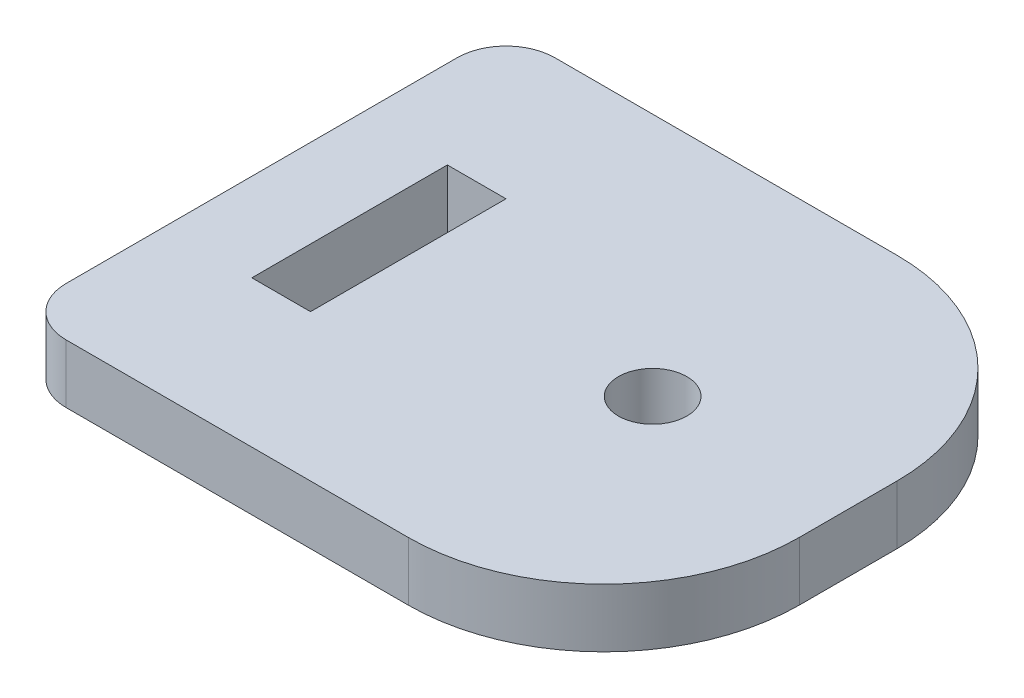
ISO-10303-21;
HEADER;
FILE_DESCRIPTION(('STEP AP214'),'2;1');
FILE_NAME('part.step','',(''),(''),'','','');
FILE_SCHEMA(('AUTOMOTIVE_DESIGN { 1 0 10303 214 1 1 1 1 }'));
ENDSEC;
DATA;
#1=APPLICATION_CONTEXT('core data for automotive mechanical design processes');
#2=APPLICATION_PROTOCOL_DEFINITION('international standard','automotive_design',2000,#1);
#3=PRODUCT_CONTEXT('',#1,'mechanical');
#4=PRODUCT('Part','Part','',(#3));
#5=PRODUCT_RELATED_PRODUCT_CATEGORY('part','',(#4));
#6=PRODUCT_DEFINITION_FORMATION('','',#4);
#7=PRODUCT_DEFINITION_CONTEXT('part definition',#1,'design');
#8=PRODUCT_DEFINITION('design','',#6,#7);
#9=PRODUCT_DEFINITION_SHAPE('','',#8);
#10=(LENGTH_UNIT() NAMED_UNIT(*) SI_UNIT(.MILLI.,.METRE.));
#11=(NAMED_UNIT(*) PLANE_ANGLE_UNIT() SI_UNIT($,.RADIAN.));
#12=(NAMED_UNIT(*) SI_UNIT($,.STERADIAN.) SOLID_ANGLE_UNIT());
#13=UNCERTAINTY_MEASURE_WITH_UNIT(LENGTH_MEASURE(1.E-05),#10,'distance_accuracy_value','');
#14=(GEOMETRIC_REPRESENTATION_CONTEXT(3) GLOBAL_UNCERTAINTY_ASSIGNED_CONTEXT((#13)) GLOBAL_UNIT_ASSIGNED_CONTEXT((#10,
#11,#12)) REPRESENTATION_CONTEXT('',''));
#15=CARTESIAN_POINT('',(0.,0.,0.));
#16=DIRECTION('',(0.,0.,1.));
#17=DIRECTION('',(1.,0.,0.));
#18=AXIS2_PLACEMENT_3D('',#15,#16,#17);
#19=CARTESIAN_POINT('',(-12.5,3.,10.));
#20=DIRECTION('',(0.,-1.,0.));
#21=DIRECTION('',(0.,0.,-1.));
#22=AXIS2_PLACEMENT_3D('',#19,#20,#21);
#23=PLANE('',#22);
#24=CARTESIAN_POINT('',(-12.5,3.,10.));
#25=DIRECTION('',(0.,1.,0.));
#26=DIRECTION('',(0.,0.,-1.));
#27=AXIS2_PLACEMENT_3D('',#24,#25,#26);
#28=CIRCLE('',#27,2.5);
#29=CARTESIAN_POINT('',(-15.,3.,9.99999999999998));
#30=VERTEX_POINT('',#29);
#31=CARTESIAN_POINT('',(-12.5,3.,12.5));
#32=VERTEX_POINT('',#31);
#33=EDGE_CURVE('E161',#30,#32,#28,.T.);
#34=ORIENTED_EDGE('',*,*,#33,.T.);
#35=DIRECTION('',(1.,0.,0.));
#36=VECTOR('',#35,1.);
#37=CARTESIAN_POINT('',(-12.5,3.,12.5));
#38=LINE('',#37,#36);
#39=CARTESIAN_POINT('',(4.99999999999993,3.,12.5));
#40=VERTEX_POINT('',#39);
#41=EDGE_CURVE('E164',#32,#40,#38,.T.);
#42=ORIENTED_EDGE('',*,*,#41,.T.);
#43=CARTESIAN_POINT('',(5.,3.,2.5));
#44=DIRECTION('',(0.,1.,0.));
#45=DIRECTION('',(0.,0.,-1.));
#46=AXIS2_PLACEMENT_3D('',#43,#44,#45);
#47=CIRCLE('',#46,10.);
#48=CARTESIAN_POINT('',(15.,3.,2.49999999999993));
#49=VERTEX_POINT('',#48);
#50=EDGE_CURVE('E167',#40,#49,#47,.T.);
#51=ORIENTED_EDGE('',*,*,#50,.T.);
#52=DIRECTION('',(0.,0.,-1.));
#53=VECTOR('',#52,1.);
#54=CARTESIAN_POINT('',(15.,3.,2.49999999999993));
#55=LINE('',#54,#53);
#56=CARTESIAN_POINT('',(15.,3.,-2.49999999999993));
#57=VERTEX_POINT('',#56);
#58=EDGE_CURVE('E169',#49,#57,#55,.T.);
#59=ORIENTED_EDGE('',*,*,#58,.T.);
#60=CARTESIAN_POINT('',(5.,3.,-2.5));
#61=DIRECTION('',(0.,1.,0.));
#62=DIRECTION('',(0.,0.,1.));
#63=AXIS2_PLACEMENT_3D('',#60,#61,#62);
#64=CIRCLE('',#63,10.);
#65=CARTESIAN_POINT('',(4.99999999999993,3.,-12.5));
#66=VERTEX_POINT('',#65);
#67=EDGE_CURVE('E171',#57,#66,#64,.T.);
#68=ORIENTED_EDGE('',*,*,#67,.T.);
#69=DIRECTION('',(-1.,0.,0.));
#70=VECTOR('',#69,1.);
#71=CARTESIAN_POINT('',(-12.5,3.,-12.5));
#72=LINE('',#71,#70);
#73=CARTESIAN_POINT('',(-12.5,3.,-12.5));
#74=VERTEX_POINT('',#73);
#75=EDGE_CURVE('E173',#66,#74,#72,.T.);
#76=ORIENTED_EDGE('',*,*,#75,.T.);
#77=CARTESIAN_POINT('',(-12.5,3.,-10.));
#78=DIRECTION('',(0.,1.,0.));
#79=DIRECTION('',(0.,0.,1.));
#80=AXIS2_PLACEMENT_3D('',#77,#78,#79);
#81=CIRCLE('',#80,2.5);
#82=CARTESIAN_POINT('',(-15.,3.,-9.99999999999998));
#83=VERTEX_POINT('',#82);
#84=EDGE_CURVE('E175',#74,#83,#81,.T.);
#85=ORIENTED_EDGE('',*,*,#84,.T.);
#86=DIRECTION('',(0.,0.,1.));
#87=VECTOR('',#86,1.);
#88=CARTESIAN_POINT('',(-15.,3.,9.99999999999998));
#89=LINE('',#88,#87);
#90=EDGE_CURVE('E177',#83,#30,#89,.T.);
#91=ORIENTED_EDGE('',*,*,#90,.T.);
#92=EDGE_LOOP('',(#34,#42,#51,#59,#68,#76,#85,#91));
#93=FACE_BOUND('',#92,.T.);
#94=DIRECTION('',(0.,0.,-1.));
#95=VECTOR('',#94,1.);
#96=CARTESIAN_POINT('',(-7.5,3.,5.));
#97=LINE('',#96,#95);
#98=CARTESIAN_POINT('',(-7.5,3.,5.));
#99=VERTEX_POINT('',#98);
#100=CARTESIAN_POINT('',(-7.5,3.,-5.));
#101=VERTEX_POINT('',#100);
#102=EDGE_CURVE('E122',#99,#101,#97,.T.);
#103=ORIENTED_EDGE('',*,*,#102,.F.);
#104=DIRECTION('',(1.,0.,0.));
#105=VECTOR('',#104,1.);
#106=CARTESIAN_POINT('',(-10.5,3.,5.));
#107=LINE('',#106,#105);
#108=CARTESIAN_POINT('',(-10.5,3.,5.));
#109=VERTEX_POINT('',#108);
#110=EDGE_CURVE('E145',#109,#99,#107,.T.);
#111=ORIENTED_EDGE('',*,*,#110,.F.);
#112=DIRECTION('',(0.,0.,1.));
#113=VECTOR('',#112,1.);
#114=CARTESIAN_POINT('',(-10.5,3.,5.));
#115=LINE('',#114,#113);
#116=CARTESIAN_POINT('',(-10.5,3.,-5.));
#117=VERTEX_POINT('',#116);
#118=EDGE_CURVE('E143',#117,#109,#115,.T.);
#119=ORIENTED_EDGE('',*,*,#118,.F.);
#120=DIRECTION('',(-1.,0.,0.));
#121=VECTOR('',#120,1.);
#122=CARTESIAN_POINT('',(-10.5,3.,-5.));
#123=LINE('',#122,#121);
#124=EDGE_CURVE('E130',#101,#117,#123,.T.);
#125=ORIENTED_EDGE('',*,*,#124,.F.);
#126=EDGE_LOOP('',(#103,#111,#119,#125));
#127=FACE_BOUND('',#126,.T.);
#128=CARTESIAN_POINT('',(5.,3.,0.));
#129=DIRECTION('',(0.,1.,0.));
#130=DIRECTION('',(0.,0.,1.));
#131=AXIS2_PLACEMENT_3D('',#128,#129,#130);
#132=CIRCLE('',#131,1.75);
#133=CARTESIAN_POINT('',(5.,3.,1.75));
#134=VERTEX_POINT('',#133);
#135=EDGE_CURVE('E151',#134,#134,#132,.T.);
#136=ORIENTED_EDGE('',*,*,#135,.F.);
#137=EDGE_LOOP('',(#136));
#138=FACE_BOUND('',#137,.T.);
#139=ADVANCED_FACE('F33',(#93,#127,#138),#23,.F.);
#140=CARTESIAN_POINT('',(-12.5,0.,10.));
#141=DIRECTION('',(0.,-1.,0.));
#142=DIRECTION('',(0.,0.,-1.));
#143=AXIS2_PLACEMENT_3D('',#140,#141,#142);
#144=PLANE('',#143);
#145=DIRECTION('',(1.,0.,0.));
#146=VECTOR('',#145,1.);
#147=CARTESIAN_POINT('',(-10.5,0.,5.));
#148=LINE('',#147,#146);
#149=CARTESIAN_POINT('',(-10.5,0.,5.));
#150=VERTEX_POINT('',#149);
#151=CARTESIAN_POINT('',(-7.5,0.,5.));
#152=VERTEX_POINT('',#151);
#153=EDGE_CURVE('E131',#150,#152,#148,.T.);
#154=ORIENTED_EDGE('',*,*,#153,.T.);
#155=DIRECTION('',(0.,0.,-1.));
#156=VECTOR('',#155,1.);
#157=CARTESIAN_POINT('',(-7.5,0.,5.));
#158=LINE('',#157,#156);
#159=CARTESIAN_POINT('',(-7.5,0.,-5.));
#160=VERTEX_POINT('',#159);
#161=EDGE_CURVE('E56',#152,#160,#158,.T.);
#162=ORIENTED_EDGE('',*,*,#161,.T.);
#163=DIRECTION('',(-1.,0.,0.));
#164=VECTOR('',#163,1.);
#165=CARTESIAN_POINT('',(-10.5,0.,-5.));
#166=LINE('',#165,#164);
#167=CARTESIAN_POINT('',(-10.5,0.,-5.));
#168=VERTEX_POINT('',#167);
#169=EDGE_CURVE('E137',#160,#168,#166,.T.);
#170=ORIENTED_EDGE('',*,*,#169,.T.);
#171=DIRECTION('',(0.,0.,1.));
#172=VECTOR('',#171,1.);
#173=CARTESIAN_POINT('',(-10.5,0.,5.));
#174=LINE('',#173,#172);
#175=EDGE_CURVE('E153',#168,#150,#174,.T.);
#176=ORIENTED_EDGE('',*,*,#175,.T.);
#177=EDGE_LOOP('',(#154,#162,#170,#176));
#178=FACE_BOUND('',#177,.T.);
#179=CARTESIAN_POINT('',(-12.5,0.,10.));
#180=DIRECTION('',(0.,1.,0.));
#181=DIRECTION('',(0.,0.,-1.));
#182=AXIS2_PLACEMENT_3D('',#179,#180,#181);
#183=CIRCLE('',#182,2.5);
#184=CARTESIAN_POINT('',(-15.,0.,9.99999999999998));
#185=VERTEX_POINT('',#184);
#186=CARTESIAN_POINT('',(-12.5,0.,12.5));
#187=VERTEX_POINT('',#186);
#188=EDGE_CURVE('E138',#185,#187,#183,.T.);
#189=ORIENTED_EDGE('',*,*,#188,.F.);
#190=DIRECTION('',(0.,0.,1.));
#191=VECTOR('',#190,1.);
#192=CARTESIAN_POINT('',(-15.,0.,9.99999999999998));
#193=LINE('',#192,#191);
#194=CARTESIAN_POINT('',(-15.,0.,-9.99999999999998));
#195=VERTEX_POINT('',#194);
#196=EDGE_CURVE('E165',#195,#185,#193,.T.);
#197=ORIENTED_EDGE('',*,*,#196,.F.);
#198=CARTESIAN_POINT('',(-12.5,0.,-10.));
#199=DIRECTION('',(0.,1.,0.));
#200=DIRECTION('',(0.,0.,1.));
#201=AXIS2_PLACEMENT_3D('',#198,#199,#200);
#202=CIRCLE('',#201,2.5);
#203=CARTESIAN_POINT('',(-12.5,0.,-12.5));
#204=VERTEX_POINT('',#203);
#205=EDGE_CURVE('E192',#204,#195,#202,.T.);
#206=ORIENTED_EDGE('',*,*,#205,.F.);
#207=DIRECTION('',(-1.,0.,0.));
#208=VECTOR('',#207,1.);
#209=CARTESIAN_POINT('',(-12.5,0.,-12.5));
#210=LINE('',#209,#208);
#211=CARTESIAN_POINT('',(4.99999999999993,0.,-12.5));
#212=VERTEX_POINT('',#211);
#213=EDGE_CURVE('E190',#212,#204,#210,.T.);
#214=ORIENTED_EDGE('',*,*,#213,.F.);
#215=CARTESIAN_POINT('',(5.,0.,-2.5));
#216=DIRECTION('',(0.,1.,0.));
#217=DIRECTION('',(0.,0.,1.));
#218=AXIS2_PLACEMENT_3D('',#215,#216,#217);
#219=CIRCLE('',#218,10.);
#220=CARTESIAN_POINT('',(15.,0.,-2.49999999999993));
#221=VERTEX_POINT('',#220);
#222=EDGE_CURVE('E188',#221,#212,#219,.T.);
#223=ORIENTED_EDGE('',*,*,#222,.F.);
#224=DIRECTION('',(0.,0.,-1.));
#225=VECTOR('',#224,1.);
#226=CARTESIAN_POINT('',(15.,0.,2.49999999999993));
#227=LINE('',#226,#225);
#228=CARTESIAN_POINT('',(15.,0.,2.49999999999993));
#229=VERTEX_POINT('',#228);
#230=EDGE_CURVE('E186',#229,#221,#227,.T.);
#231=ORIENTED_EDGE('',*,*,#230,.F.);
#232=CARTESIAN_POINT('',(5.,0.,2.5));
#233=DIRECTION('',(0.,1.,0.));
#234=DIRECTION('',(0.,0.,-1.));
#235=AXIS2_PLACEMENT_3D('',#232,#233,#234);
#236=CIRCLE('',#235,10.);
#237=CARTESIAN_POINT('',(4.99999999999993,0.,12.5));
#238=VERTEX_POINT('',#237);
#239=EDGE_CURVE('E184',#238,#229,#236,.T.);
#240=ORIENTED_EDGE('',*,*,#239,.F.);
#241=DIRECTION('',(1.,0.,0.));
#242=VECTOR('',#241,1.);
#243=CARTESIAN_POINT('',(-12.5,0.,12.5));
#244=LINE('',#243,#242);
#245=EDGE_CURVE('E182',#187,#238,#244,.T.);
#246=ORIENTED_EDGE('',*,*,#245,.F.);
#247=EDGE_LOOP('',(#189,#197,#206,#214,#223,#231,#240,#246));
#248=FACE_BOUND('',#247,.T.);
#249=CARTESIAN_POINT('',(5.,0.,0.));
#250=DIRECTION('',(0.,1.,0.));
#251=DIRECTION('',(0.,0.,1.));
#252=AXIS2_PLACEMENT_3D('',#249,#250,#251);
#253=CIRCLE('',#252,1.75);
#254=CARTESIAN_POINT('',(5.,0.,1.75));
#255=VERTEX_POINT('',#254);
#256=EDGE_CURVE('E298',#255,#255,#253,.T.);
#257=ORIENTED_EDGE('',*,*,#256,.T.);
#258=EDGE_LOOP('',(#257));
#259=FACE_BOUND('',#258,.T.);
#260=ADVANCED_FACE('F222',(#178,#248,#259),#144,.T.);
#261=CARTESIAN_POINT('',(-12.5,3.,10.));
#262=DIRECTION('',(0.,-1.,0.));
#263=DIRECTION('',(0.,0.,-1.));
#264=AXIS2_PLACEMENT_3D('',#261,#262,#263);
#265=CYLINDRICAL_SURFACE('',#264,2.5);
#266=ORIENTED_EDGE('',*,*,#188,.T.);
#267=DIRECTION('',(0.,-1.,0.));
#268=VECTOR('',#267,1.);
#269=CARTESIAN_POINT('',(-12.5,3.,12.5));
#270=LINE('',#269,#268);
#271=EDGE_CURVE('E11',#32,#187,#270,.T.);
#272=ORIENTED_EDGE('',*,*,#271,.F.);
#273=ORIENTED_EDGE('',*,*,#33,.F.);
#274=DIRECTION('',(0.,-1.,0.));
#275=VECTOR('',#274,1.);
#276=CARTESIAN_POINT('',(-15.,3.,9.99999999999998));
#277=LINE('',#276,#275);
#278=EDGE_CURVE('E179',#30,#185,#277,.T.);
#279=ORIENTED_EDGE('',*,*,#278,.T.);
#280=EDGE_LOOP('',(#266,#272,#273,#279));
#281=FACE_BOUND('',#280,.T.);
#282=ADVANCED_FACE('F35',(#281),#265,.T.);
#283=CARTESIAN_POINT('',(-12.5,3.,12.5));
#284=DIRECTION('',(0.,0.,-1.));
#285=DIRECTION('',(-1.,0.,0.));
#286=AXIS2_PLACEMENT_3D('',#283,#284,#285);
#287=PLANE('',#286);
#288=ORIENTED_EDGE('',*,*,#245,.T.);
#289=DIRECTION('',(0.,-1.,0.));
#290=VECTOR('',#289,1.);
#291=CARTESIAN_POINT('',(4.99999999999993,3.,12.5));
#292=LINE('',#291,#290);
#293=EDGE_CURVE('E41',#40,#238,#292,.T.);
#294=ORIENTED_EDGE('',*,*,#293,.F.);
#295=ORIENTED_EDGE('',*,*,#41,.F.);
#296=ORIENTED_EDGE('',*,*,#271,.T.);
#297=EDGE_LOOP('',(#288,#294,#295,#296));
#298=FACE_BOUND('',#297,.T.);
#299=ADVANCED_FACE('F239',(#298),#287,.F.);
#300=CARTESIAN_POINT('',(5.,3.,2.5));
#301=DIRECTION('',(0.,-1.,0.));
#302=DIRECTION('',(0.,0.,-1.));
#303=AXIS2_PLACEMENT_3D('',#300,#301,#302);
#304=CYLINDRICAL_SURFACE('',#303,10.);
#305=ORIENTED_EDGE('',*,*,#239,.T.);
#306=DIRECTION('',(0.,-1.,0.));
#307=VECTOR('',#306,1.);
#308=CARTESIAN_POINT('',(15.,3.,2.49999999999993));
#309=LINE('',#308,#307);
#310=EDGE_CURVE('E209',#49,#229,#309,.T.);
#311=ORIENTED_EDGE('',*,*,#310,.F.);
#312=ORIENTED_EDGE('',*,*,#50,.F.);
#313=ORIENTED_EDGE('',*,*,#293,.T.);
#314=EDGE_LOOP('',(#305,#311,#312,#313));
#315=FACE_BOUND('',#314,.T.);
#316=ADVANCED_FACE('F216',(#315),#304,.T.);
#317=CARTESIAN_POINT('',(15.,3.,2.49999999999993));
#318=DIRECTION('',(-1.,0.,0.));
#319=DIRECTION('',(0.,0.,1.));
#320=AXIS2_PLACEMENT_3D('',#317,#318,#319);
#321=PLANE('',#320);
#322=ORIENTED_EDGE('',*,*,#230,.T.);
#323=DIRECTION('',(0.,-1.,0.));
#324=VECTOR('',#323,1.);
#325=CARTESIAN_POINT('',(15.,3.,-2.49999999999993));
#326=LINE('',#325,#324);
#327=EDGE_CURVE('E206',#57,#221,#326,.T.);
#328=ORIENTED_EDGE('',*,*,#327,.F.);
#329=ORIENTED_EDGE('',*,*,#58,.F.);
#330=ORIENTED_EDGE('',*,*,#310,.T.);
#331=EDGE_LOOP('',(#322,#328,#329,#330));
#332=FACE_BOUND('',#331,.T.);
#333=ADVANCED_FACE('F228',(#332),#321,.F.);
#334=CARTESIAN_POINT('',(5.,3.,-2.5));
#335=DIRECTION('',(0.,-1.,0.));
#336=DIRECTION('',(0.,0.,-1.));
#337=AXIS2_PLACEMENT_3D('',#334,#335,#336);
#338=CYLINDRICAL_SURFACE('',#337,10.);
#339=ORIENTED_EDGE('',*,*,#222,.T.);
#340=DIRECTION('',(0.,-1.,0.));
#341=VECTOR('',#340,1.);
#342=CARTESIAN_POINT('',(4.99999999999993,3.,-12.5));
#343=LINE('',#342,#341);
#344=EDGE_CURVE('E203',#66,#212,#343,.T.);
#345=ORIENTED_EDGE('',*,*,#344,.F.);
#346=ORIENTED_EDGE('',*,*,#67,.F.);
#347=ORIENTED_EDGE('',*,*,#327,.T.);
#348=EDGE_LOOP('',(#339,#345,#346,#347));
#349=FACE_BOUND('',#348,.T.);
#350=ADVANCED_FACE('F232',(#349),#338,.T.);
#351=CARTESIAN_POINT('',(-12.5,3.,-12.5));
#352=DIRECTION('',(0.,0.,1.));
#353=DIRECTION('',(1.,0.,0.));
#354=AXIS2_PLACEMENT_3D('',#351,#352,#353);
#355=PLANE('',#354);
#356=ORIENTED_EDGE('',*,*,#213,.T.);
#357=DIRECTION('',(0.,-1.,0.));
#358=VECTOR('',#357,1.);
#359=CARTESIAN_POINT('',(-12.5,3.,-12.5));
#360=LINE('',#359,#358);
#361=EDGE_CURVE('E200',#74,#204,#360,.T.);
#362=ORIENTED_EDGE('',*,*,#361,.F.);
#363=ORIENTED_EDGE('',*,*,#75,.F.);
#364=ORIENTED_EDGE('',*,*,#344,.T.);
#365=EDGE_LOOP('',(#356,#362,#363,#364));
#366=FACE_BOUND('',#365,.T.);
#367=ADVANCED_FACE('F252',(#366),#355,.F.);
#368=CARTESIAN_POINT('',(-12.5,3.,-10.));
#369=DIRECTION('',(0.,-1.,0.));
#370=DIRECTION('',(0.,0.,-1.));
#371=AXIS2_PLACEMENT_3D('',#368,#369,#370);
#372=CYLINDRICAL_SURFACE('',#371,2.5);
#373=ORIENTED_EDGE('',*,*,#205,.T.);
#374=DIRECTION('',(0.,-1.,0.));
#375=VECTOR('',#374,1.);
#376=CARTESIAN_POINT('',(-15.,3.,-9.99999999999998));
#377=LINE('',#376,#375);
#378=EDGE_CURVE('E197',#83,#195,#377,.T.);
#379=ORIENTED_EDGE('',*,*,#378,.F.);
#380=ORIENTED_EDGE('',*,*,#84,.F.);
#381=ORIENTED_EDGE('',*,*,#361,.T.);
#382=EDGE_LOOP('',(#373,#379,#380,#381));
#383=FACE_BOUND('',#382,.T.);
#384=ADVANCED_FACE('F250',(#383),#372,.T.);
#385=CARTESIAN_POINT('',(-15.,3.,9.99999999999998));
#386=DIRECTION('',(1.,0.,0.));
#387=DIRECTION('',(0.,0.,-1.));
#388=AXIS2_PLACEMENT_3D('',#385,#386,#387);
#389=PLANE('',#388);
#390=ORIENTED_EDGE('',*,*,#196,.T.);
#391=ORIENTED_EDGE('',*,*,#278,.F.);
#392=ORIENTED_EDGE('',*,*,#90,.F.);
#393=ORIENTED_EDGE('',*,*,#378,.T.);
#394=EDGE_LOOP('',(#390,#391,#392,#393));
#395=FACE_BOUND('',#394,.T.);
#396=ADVANCED_FACE('F245',(#395),#389,.F.);
#397=CARTESIAN_POINT('',(-7.5,3.,5.));
#398=DIRECTION('',(-1.,0.,0.));
#399=DIRECTION('',(0.,0.,1.));
#400=AXIS2_PLACEMENT_3D('',#397,#398,#399);
#401=PLANE('',#400);
#402=ORIENTED_EDGE('',*,*,#161,.F.);
#403=DIRECTION('',(0.,-1.,0.));
#404=VECTOR('',#403,1.);
#405=CARTESIAN_POINT('',(-7.5,3.,5.));
#406=LINE('',#405,#404);
#407=EDGE_CURVE('E126',#99,#152,#406,.T.);
#408=ORIENTED_EDGE('',*,*,#407,.F.);
#409=ORIENTED_EDGE('',*,*,#102,.T.);
#410=DIRECTION('',(0.,-1.,0.));
#411=VECTOR('',#410,1.);
#412=CARTESIAN_POINT('',(-7.5,3.,-5.));
#413=LINE('',#412,#411);
#414=EDGE_CURVE('E125',#101,#160,#413,.T.);
#415=ORIENTED_EDGE('',*,*,#414,.T.);
#416=EDGE_LOOP('',(#402,#408,#409,#415));
#417=FACE_BOUND('',#416,.T.);
#418=ADVANCED_FACE('F124',(#417),#401,.T.);
#419=CARTESIAN_POINT('',(-10.5,3.,-5.));
#420=DIRECTION('',(0.,0.,1.));
#421=DIRECTION('',(1.,0.,0.));
#422=AXIS2_PLACEMENT_3D('',#419,#420,#421);
#423=PLANE('',#422);
#424=ORIENTED_EDGE('',*,*,#169,.F.);
#425=ORIENTED_EDGE('',*,*,#414,.F.);
#426=ORIENTED_EDGE('',*,*,#124,.T.);
#427=DIRECTION('',(0.,-1.,0.));
#428=VECTOR('',#427,1.);
#429=CARTESIAN_POINT('',(-10.5,3.,-5.));
#430=LINE('',#429,#428);
#431=EDGE_CURVE('E139',#117,#168,#430,.T.);
#432=ORIENTED_EDGE('',*,*,#431,.T.);
#433=EDGE_LOOP('',(#424,#425,#426,#432));
#434=FACE_BOUND('',#433,.T.);
#435=ADVANCED_FACE('F134',(#434),#423,.T.);
#436=CARTESIAN_POINT('',(-10.5,3.,5.));
#437=DIRECTION('',(1.,0.,0.));
#438=DIRECTION('',(0.,0.,-1.));
#439=AXIS2_PLACEMENT_3D('',#436,#437,#438);
#440=PLANE('',#439);
#441=ORIENTED_EDGE('',*,*,#175,.F.);
#442=ORIENTED_EDGE('',*,*,#431,.F.);
#443=ORIENTED_EDGE('',*,*,#118,.T.);
#444=DIRECTION('',(0.,-1.,0.));
#445=VECTOR('',#444,1.);
#446=CARTESIAN_POINT('',(-10.5,3.,5.));
#447=LINE('',#446,#445);
#448=EDGE_CURVE('E48',#109,#150,#447,.T.);
#449=ORIENTED_EDGE('',*,*,#448,.T.);
#450=EDGE_LOOP('',(#441,#442,#443,#449));
#451=FACE_BOUND('',#450,.T.);
#452=ADVANCED_FACE('F278',(#451),#440,.T.);
#453=CARTESIAN_POINT('',(-10.5,3.,5.));
#454=DIRECTION('',(0.,0.,-1.));
#455=DIRECTION('',(-1.,0.,0.));
#456=AXIS2_PLACEMENT_3D('',#453,#454,#455);
#457=PLANE('',#456);
#458=ORIENTED_EDGE('',*,*,#153,.F.);
#459=ORIENTED_EDGE('',*,*,#448,.F.);
#460=ORIENTED_EDGE('',*,*,#110,.T.);
#461=ORIENTED_EDGE('',*,*,#407,.T.);
#462=EDGE_LOOP('',(#458,#459,#460,#461));
#463=FACE_BOUND('',#462,.T.);
#464=ADVANCED_FACE('F282',(#463),#457,.T.);
#465=CARTESIAN_POINT('',(5.,3.,0.));
#466=DIRECTION('',(0.,-1.,0.));
#467=DIRECTION('',(0.,0.,-1.));
#468=AXIS2_PLACEMENT_3D('',#465,#466,#467);
#469=CYLINDRICAL_SURFACE('',#468,1.75);
#470=ORIENTED_EDGE('',*,*,#135,.T.);
#471=EDGE_LOOP('',(#470));
#472=FACE_BOUND('',#471,.T.);
#473=ORIENTED_EDGE('',*,*,#256,.F.);
#474=EDGE_LOOP('',(#473));
#475=FACE_BOUND('',#474,.T.);
#476=ADVANCED_FACE('F288',(#472,#475),#469,.F.);
#477=CLOSED_SHELL('',(#139,#260,#282,#299,#316,#333,#350,#367,#384,#396,#418,#435,#452,#464,#476));
#478=MANIFOLD_SOLID_BREP('B2',#477);
#479=ADVANCED_BREP_SHAPE_REPRESENTATION('',(#18,#478),#14);
#480=SHAPE_DEFINITION_REPRESENTATION(#9,#479);
ENDSEC;
END-ISO-10303-21;
